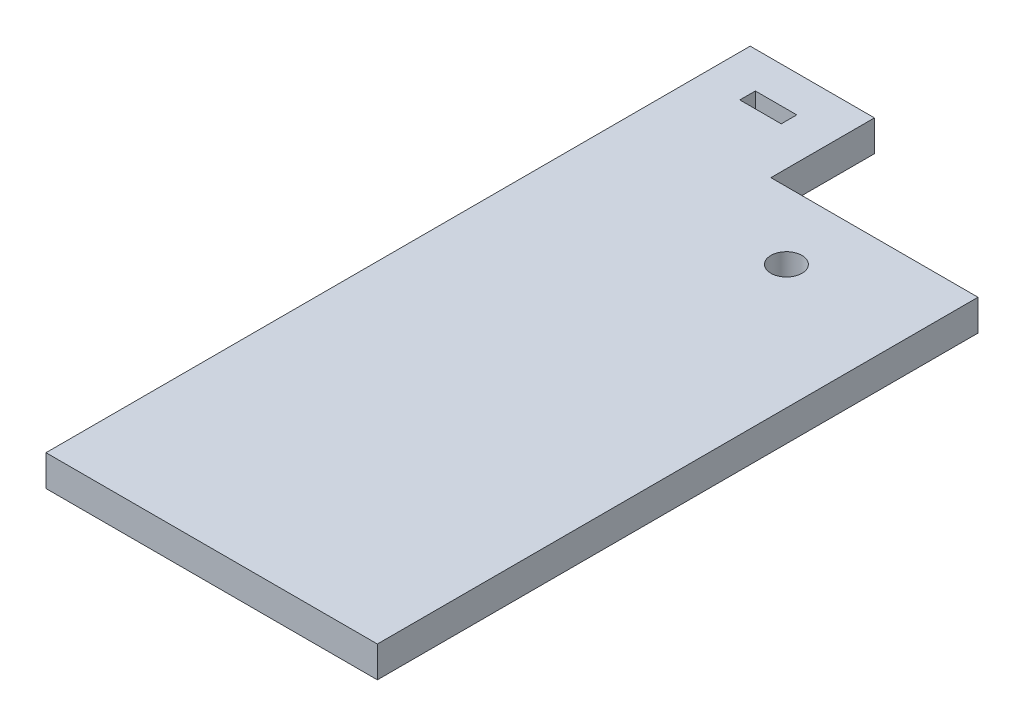
ISO-10303-21;
HEADER;
FILE_DESCRIPTION(('STEP AP214'),'2;1');
FILE_NAME('part.step','',(''),(''),'','','');
FILE_SCHEMA(('AUTOMOTIVE_DESIGN { 1 0 10303 214 1 1 1 1 }'));
ENDSEC;
DATA;
#1=APPLICATION_CONTEXT('core data for automotive mechanical design processes');
#2=APPLICATION_PROTOCOL_DEFINITION('international standard','automotive_design',2000,#1);
#3=PRODUCT_CONTEXT('',#1,'mechanical');
#4=PRODUCT('Part','Part','',(#3));
#5=PRODUCT_RELATED_PRODUCT_CATEGORY('part','',(#4));
#6=PRODUCT_DEFINITION_FORMATION('','',#4);
#7=PRODUCT_DEFINITION_CONTEXT('part definition',#1,'design');
#8=PRODUCT_DEFINITION('design','',#6,#7);
#9=PRODUCT_DEFINITION_SHAPE('','',#8);
#10=(LENGTH_UNIT() NAMED_UNIT(*) SI_UNIT(.MILLI.,.METRE.));
#11=(NAMED_UNIT(*) PLANE_ANGLE_UNIT() SI_UNIT($,.RADIAN.));
#12=(NAMED_UNIT(*) SI_UNIT($,.STERADIAN.) SOLID_ANGLE_UNIT());
#13=UNCERTAINTY_MEASURE_WITH_UNIT(LENGTH_MEASURE(1.E-05),#10,'distance_accuracy_value','');
#14=(GEOMETRIC_REPRESENTATION_CONTEXT(3) GLOBAL_UNCERTAINTY_ASSIGNED_CONTEXT((#13)) GLOBAL_UNIT_ASSIGNED_CONTEXT((#10,
#11,#12)) REPRESENTATION_CONTEXT('',''));
#15=CARTESIAN_POINT('',(0.,0.,0.));
#16=DIRECTION('',(0.,0.,1.));
#17=DIRECTION('',(1.,0.,0.));
#18=AXIS2_PLACEMENT_3D('',#15,#16,#17);
#19=CARTESIAN_POINT('',(0.,3.,0.));
#20=DIRECTION('',(0.,-1.,0.));
#21=DIRECTION('',(0.,0.,-1.));
#22=AXIS2_PLACEMENT_3D('',#19,#20,#21);
#23=PLANE('',#22);
#24=CARTESIAN_POINT('',(20.,3.,-51.5));
#25=DIRECTION('',(0.,1.,0.));
#26=DIRECTION('',(0.,0.,1.));
#27=AXIS2_PLACEMENT_3D('',#24,#25,#26);
#28=CIRCLE('',#27,1.5);
#29=CARTESIAN_POINT('',(20.,3.,-50.));
#30=VERTEX_POINT('',#29);
#31=EDGE_CURVE('E162',#30,#30,#28,.T.);
#32=ORIENTED_EDGE('',*,*,#31,.F.);
#33=EDGE_LOOP('',(#32));
#34=FACE_BOUND('',#33,.T.);
#35=DIRECTION('',(1.,0.,0.));
#36=VECTOR('',#35,1.);
#37=CARTESIAN_POINT('',(0.,3.,0.));
#38=LINE('',#37,#36);
#39=CARTESIAN_POINT('',(0.,3.,0.));
#40=VERTEX_POINT('',#39);
#41=CARTESIAN_POINT('',(32.,3.,0.));
#42=VERTEX_POINT('',#41);
#43=EDGE_CURVE('E132',#40,#42,#38,.T.);
#44=ORIENTED_EDGE('',*,*,#43,.T.);
#45=DIRECTION('',(0.,0.,1.));
#46=VECTOR('',#45,1.);
#47=CARTESIAN_POINT('',(32.,3.,-68.));
#48=LINE('',#47,#46);
#49=CARTESIAN_POINT('',(32.,3.,-58.));
#50=VERTEX_POINT('',#49);
#51=EDGE_CURVE('E120',#50,#42,#48,.T.);
#52=ORIENTED_EDGE('',*,*,#51,.F.);
#53=DIRECTION('',(-1.,0.,0.));
#54=VECTOR('',#53,1.);
#55=CARTESIAN_POINT('',(12.,3.,-58.));
#56=LINE('',#55,#54);
#57=CARTESIAN_POINT('',(12.,3.,-58.));
#58=VERTEX_POINT('',#57);
#59=EDGE_CURVE('E143',#50,#58,#56,.T.);
#60=ORIENTED_EDGE('',*,*,#59,.T.);
#61=DIRECTION('',(0.,0.,-1.));
#62=VECTOR('',#61,1.);
#63=CARTESIAN_POINT('',(12.,3.,-68.));
#64=LINE('',#63,#62);
#65=CARTESIAN_POINT('',(12.,3.,-68.));
#66=VERTEX_POINT('',#65);
#67=EDGE_CURVE('E147',#58,#66,#64,.T.);
#68=ORIENTED_EDGE('',*,*,#67,.T.);
#69=DIRECTION('',(-1.,0.,0.));
#70=VECTOR('',#69,1.);
#71=CARTESIAN_POINT('',(0.,3.,-68.));
#72=LINE('',#71,#70);
#73=CARTESIAN_POINT('',(0.,3.,-68.));
#74=VERTEX_POINT('',#73);
#75=EDGE_CURVE('E155',#66,#74,#72,.T.);
#76=ORIENTED_EDGE('',*,*,#75,.T.);
#77=DIRECTION('',(0.,0.,1.));
#78=VECTOR('',#77,1.);
#79=CARTESIAN_POINT('',(0.,3.,0.));
#80=LINE('',#79,#78);
#81=EDGE_CURVE('E140',#74,#40,#80,.T.);
#82=ORIENTED_EDGE('',*,*,#81,.T.);
#83=EDGE_LOOP('',(#44,#52,#60,#68,#76,#82));
#84=FACE_BOUND('',#83,.T.);
#85=DIRECTION('',(0.,0.,1.));
#86=VECTOR('',#85,1.);
#87=CARTESIAN_POINT('',(4.,3.,-64.5));
#88=LINE('',#87,#86);
#89=CARTESIAN_POINT('',(4.,3.,-64.5));
#90=VERTEX_POINT('',#89);
#91=CARTESIAN_POINT('',(4.,3.,-63.));
#92=VERTEX_POINT('',#91);
#93=EDGE_CURVE('E202',#90,#92,#88,.T.);
#94=ORIENTED_EDGE('',*,*,#93,.F.);
#95=DIRECTION('',(-1.,0.,0.));
#96=VECTOR('',#95,1.);
#97=CARTESIAN_POINT('',(4.,3.,-64.5));
#98=LINE('',#97,#96);
#99=CARTESIAN_POINT('',(8.,3.,-64.5));
#100=VERTEX_POINT('',#99);
#101=EDGE_CURVE('E212',#100,#90,#98,.T.);
#102=ORIENTED_EDGE('',*,*,#101,.F.);
#103=DIRECTION('',(0.,0.,-1.));
#104=VECTOR('',#103,1.);
#105=CARTESIAN_POINT('',(8.,3.,-64.5));
#106=LINE('',#105,#104);
#107=CARTESIAN_POINT('',(8.,3.,-63.));
#108=VERTEX_POINT('',#107);
#109=EDGE_CURVE('E209',#108,#100,#106,.T.);
#110=ORIENTED_EDGE('',*,*,#109,.F.);
#111=DIRECTION('',(1.,0.,0.));
#112=VECTOR('',#111,1.);
#113=CARTESIAN_POINT('',(4.,3.,-63.));
#114=LINE('',#113,#112);
#115=EDGE_CURVE('E205',#92,#108,#114,.T.);
#116=ORIENTED_EDGE('',*,*,#115,.F.);
#117=EDGE_LOOP('',(#94,#102,#110,#116));
#118=FACE_BOUND('',#117,.T.);
#119=ADVANCED_FACE('F45',(#34,#84,#118),#23,.F.);
#120=CARTESIAN_POINT('',(0.,0.,0.));
#121=DIRECTION('',(0.,-1.,0.));
#122=DIRECTION('',(0.,0.,-1.));
#123=AXIS2_PLACEMENT_3D('',#120,#121,#122);
#124=PLANE('',#123);
#125=DIRECTION('',(0.,0.,1.));
#126=VECTOR('',#125,1.);
#127=CARTESIAN_POINT('',(32.,0.,-68.));
#128=LINE('',#127,#126);
#129=CARTESIAN_POINT('',(32.,0.,-58.));
#130=VERTEX_POINT('',#129);
#131=CARTESIAN_POINT('',(32.,0.,0.));
#132=VERTEX_POINT('',#131);
#133=EDGE_CURVE('E61',#130,#132,#128,.T.);
#134=ORIENTED_EDGE('',*,*,#133,.T.);
#135=DIRECTION('',(1.,0.,0.));
#136=VECTOR('',#135,1.);
#137=CARTESIAN_POINT('',(0.,0.,0.));
#138=LINE('',#137,#136);
#139=CARTESIAN_POINT('',(0.,0.,0.));
#140=VERTEX_POINT('',#139);
#141=EDGE_CURVE('E135',#140,#132,#138,.T.);
#142=ORIENTED_EDGE('',*,*,#141,.F.);
#143=DIRECTION('',(0.,0.,1.));
#144=VECTOR('',#143,1.);
#145=CARTESIAN_POINT('',(0.,0.,-58.));
#146=LINE('',#145,#144);
#147=CARTESIAN_POINT('',(0.,0.,-68.));
#148=VERTEX_POINT('',#147);
#149=EDGE_CURVE('E149',#148,#140,#146,.T.);
#150=ORIENTED_EDGE('',*,*,#149,.F.);
#151=DIRECTION('',(-1.,0.,0.));
#152=VECTOR('',#151,1.);
#153=CARTESIAN_POINT('',(0.,0.,-68.));
#154=LINE('',#153,#152);
#155=CARTESIAN_POINT('',(12.,0.,-68.));
#156=VERTEX_POINT('',#155);
#157=EDGE_CURVE('E168',#156,#148,#154,.T.);
#158=ORIENTED_EDGE('',*,*,#157,.F.);
#159=DIRECTION('',(0.,0.,-1.));
#160=VECTOR('',#159,1.);
#161=CARTESIAN_POINT('',(12.,0.,-68.));
#162=LINE('',#161,#160);
#163=CARTESIAN_POINT('',(12.,0.,-58.));
#164=VERTEX_POINT('',#163);
#165=EDGE_CURVE('E165',#164,#156,#162,.T.);
#166=ORIENTED_EDGE('',*,*,#165,.F.);
#167=DIRECTION('',(-1.,0.,0.));
#168=VECTOR('',#167,1.);
#169=CARTESIAN_POINT('',(12.,0.,-58.));
#170=LINE('',#169,#168);
#171=EDGE_CURVE('E161',#130,#164,#170,.T.);
#172=ORIENTED_EDGE('',*,*,#171,.F.);
#173=EDGE_LOOP('',(#134,#142,#150,#158,#166,#172));
#174=FACE_BOUND('',#173,.T.);
#175=CARTESIAN_POINT('',(20.,0.,-51.5));
#176=DIRECTION('',(0.,1.,0.));
#177=DIRECTION('',(0.,0.,1.));
#178=AXIS2_PLACEMENT_3D('',#175,#176,#177);
#179=CIRCLE('',#178,1.5);
#180=CARTESIAN_POINT('',(20.,0.,-50.));
#181=VERTEX_POINT('',#180);
#182=EDGE_CURVE('E238',#181,#181,#179,.T.);
#183=ORIENTED_EDGE('',*,*,#182,.T.);
#184=EDGE_LOOP('',(#183));
#185=FACE_BOUND('',#184,.T.);
#186=DIRECTION('',(-1.,0.,0.));
#187=VECTOR('',#186,1.);
#188=CARTESIAN_POINT('',(4.,0.,-64.5));
#189=LINE('',#188,#187);
#190=CARTESIAN_POINT('',(8.,0.,-64.5));
#191=VERTEX_POINT('',#190);
#192=CARTESIAN_POINT('',(4.,0.,-64.5));
#193=VERTEX_POINT('',#192);
#194=EDGE_CURVE('E206',#191,#193,#189,.T.);
#195=ORIENTED_EDGE('',*,*,#194,.T.);
#196=DIRECTION('',(0.,0.,1.));
#197=VECTOR('',#196,1.);
#198=CARTESIAN_POINT('',(4.,0.,-64.5));
#199=LINE('',#198,#197);
#200=CARTESIAN_POINT('',(4.,0.,-63.));
#201=VERTEX_POINT('',#200);
#202=EDGE_CURVE('E195',#193,#201,#199,.T.);
#203=ORIENTED_EDGE('',*,*,#202,.T.);
#204=DIRECTION('',(1.,0.,0.));
#205=VECTOR('',#204,1.);
#206=CARTESIAN_POINT('',(4.,0.,-63.));
#207=LINE('',#206,#205);
#208=CARTESIAN_POINT('',(8.,0.,-63.));
#209=VERTEX_POINT('',#208);
#210=EDGE_CURVE('E199',#201,#209,#207,.T.);
#211=ORIENTED_EDGE('',*,*,#210,.T.);
#212=DIRECTION('',(0.,0.,-1.));
#213=VECTOR('',#212,1.);
#214=CARTESIAN_POINT('',(8.,0.,-64.5));
#215=LINE('',#214,#213);
#216=EDGE_CURVE('E219',#209,#191,#215,.T.);
#217=ORIENTED_EDGE('',*,*,#216,.T.);
#218=EDGE_LOOP('',(#195,#203,#211,#217));
#219=FACE_BOUND('',#218,.T.);
#220=ADVANCED_FACE('F190',(#174,#185,#219),#124,.T.);
#221=CARTESIAN_POINT('',(0.,3.,0.));
#222=DIRECTION('',(0.,0.,-1.));
#223=DIRECTION('',(-1.,0.,0.));
#224=AXIS2_PLACEMENT_3D('',#221,#222,#223);
#225=PLANE('',#224);
#226=ORIENTED_EDGE('',*,*,#141,.T.);
#227=DIRECTION('',(0.,-1.,0.));
#228=VECTOR('',#227,1.);
#229=CARTESIAN_POINT('',(32.,0.,0.));
#230=LINE('',#229,#228);
#231=EDGE_CURVE('E123',#42,#132,#230,.T.);
#232=ORIENTED_EDGE('',*,*,#231,.F.);
#233=ORIENTED_EDGE('',*,*,#43,.F.);
#234=DIRECTION('',(0.,-1.,0.));
#235=VECTOR('',#234,1.);
#236=CARTESIAN_POINT('',(0.,3.,0.));
#237=LINE('',#236,#235);
#238=EDGE_CURVE('E54',#40,#140,#237,.T.);
#239=ORIENTED_EDGE('',*,*,#238,.T.);
#240=EDGE_LOOP('',(#226,#232,#233,#239));
#241=FACE_BOUND('',#240,.T.);
#242=ADVANCED_FACE('F47',(#241),#225,.F.);
#243=CARTESIAN_POINT('',(12.,3.,-58.));
#244=DIRECTION('',(0.,0.,1.));
#245=DIRECTION('',(1.,0.,0.));
#246=AXIS2_PLACEMENT_3D('',#243,#244,#245);
#247=PLANE('',#246);
#248=ORIENTED_EDGE('',*,*,#59,.F.);
#249=DIRECTION('',(0.,-1.,0.));
#250=VECTOR('',#249,1.);
#251=CARTESIAN_POINT('',(32.,3.,-58.));
#252=LINE('',#251,#250);
#253=EDGE_CURVE('E11',#50,#130,#252,.T.);
#254=ORIENTED_EDGE('',*,*,#253,.T.);
#255=ORIENTED_EDGE('',*,*,#171,.T.);
#256=DIRECTION('',(0.,-1.,0.));
#257=VECTOR('',#256,1.);
#258=CARTESIAN_POINT('',(12.,3.,-58.));
#259=LINE('',#258,#257);
#260=EDGE_CURVE('E180',#58,#164,#259,.T.);
#261=ORIENTED_EDGE('',*,*,#260,.F.);
#262=EDGE_LOOP('',(#248,#254,#255,#261));
#263=FACE_BOUND('',#262,.T.);
#264=ADVANCED_FACE('F275',(#263),#247,.F.);
#265=CARTESIAN_POINT('',(12.,3.,-68.));
#266=DIRECTION('',(-1.,0.,0.));
#267=DIRECTION('',(0.,0.,1.));
#268=AXIS2_PLACEMENT_3D('',#265,#266,#267);
#269=PLANE('',#268);
#270=ORIENTED_EDGE('',*,*,#165,.T.);
#271=DIRECTION('',(0.,-1.,0.));
#272=VECTOR('',#271,1.);
#273=CARTESIAN_POINT('',(12.,3.,-68.));
#274=LINE('',#273,#272);
#275=EDGE_CURVE('E176',#66,#156,#274,.T.);
#276=ORIENTED_EDGE('',*,*,#275,.F.);
#277=ORIENTED_EDGE('',*,*,#67,.F.);
#278=ORIENTED_EDGE('',*,*,#260,.T.);
#279=EDGE_LOOP('',(#270,#276,#277,#278));
#280=FACE_BOUND('',#279,.T.);
#281=ADVANCED_FACE('F272',(#280),#269,.F.);
#282=CARTESIAN_POINT('',(0.,3.,-68.));
#283=DIRECTION('',(0.,0.,1.));
#284=DIRECTION('',(1.,0.,0.));
#285=AXIS2_PLACEMENT_3D('',#282,#283,#284);
#286=PLANE('',#285);
#287=ORIENTED_EDGE('',*,*,#157,.T.);
#288=DIRECTION('',(0.,-1.,0.));
#289=VECTOR('',#288,1.);
#290=CARTESIAN_POINT('',(0.,3.,-68.));
#291=LINE('',#290,#289);
#292=EDGE_CURVE('E158',#74,#148,#291,.T.);
#293=ORIENTED_EDGE('',*,*,#292,.F.);
#294=ORIENTED_EDGE('',*,*,#75,.F.);
#295=ORIENTED_EDGE('',*,*,#275,.T.);
#296=EDGE_LOOP('',(#287,#293,#294,#295));
#297=FACE_BOUND('',#296,.T.);
#298=ADVANCED_FACE('F258',(#297),#286,.F.);
#299=CARTESIAN_POINT('',(0.,3.,-58.));
#300=DIRECTION('',(1.,0.,0.));
#301=DIRECTION('',(0.,0.,-1.));
#302=AXIS2_PLACEMENT_3D('',#299,#300,#301);
#303=PLANE('',#302);
#304=ORIENTED_EDGE('',*,*,#149,.T.);
#305=ORIENTED_EDGE('',*,*,#238,.F.);
#306=ORIENTED_EDGE('',*,*,#81,.F.);
#307=ORIENTED_EDGE('',*,*,#292,.T.);
#308=EDGE_LOOP('',(#304,#305,#306,#307));
#309=FACE_BOUND('',#308,.T.);
#310=ADVANCED_FACE('F185',(#309),#303,.F.);
#311=CARTESIAN_POINT('',(20.,3.,-51.5));
#312=DIRECTION('',(0.,-1.,0.));
#313=DIRECTION('',(0.,0.,-1.));
#314=AXIS2_PLACEMENT_3D('',#311,#312,#313);
#315=CYLINDRICAL_SURFACE('',#314,1.5);
#316=ORIENTED_EDGE('',*,*,#31,.T.);
#317=EDGE_LOOP('',(#316));
#318=FACE_BOUND('',#317,.T.);
#319=ORIENTED_EDGE('',*,*,#182,.F.);
#320=EDGE_LOOP('',(#319));
#321=FACE_BOUND('',#320,.T.);
#322=ADVANCED_FACE('F246',(#318,#321),#315,.F.);
#323=CARTESIAN_POINT('',(4.,3.,-64.5));
#324=DIRECTION('',(1.,0.,0.));
#325=DIRECTION('',(0.,0.,-1.));
#326=AXIS2_PLACEMENT_3D('',#323,#324,#325);
#327=PLANE('',#326);
#328=ORIENTED_EDGE('',*,*,#202,.F.);
#329=DIRECTION('',(0.,-1.,0.));
#330=VECTOR('',#329,1.);
#331=CARTESIAN_POINT('',(4.,3.,-64.5));
#332=LINE('',#331,#330);
#333=EDGE_CURVE('E214',#90,#193,#332,.T.);
#334=ORIENTED_EDGE('',*,*,#333,.F.);
#335=ORIENTED_EDGE('',*,*,#93,.T.);
#336=DIRECTION('',(0.,-1.,0.));
#337=VECTOR('',#336,1.);
#338=CARTESIAN_POINT('',(4.,3.,-63.));
#339=LINE('',#338,#337);
#340=EDGE_CURVE('E234',#92,#201,#339,.T.);
#341=ORIENTED_EDGE('',*,*,#340,.T.);
#342=EDGE_LOOP('',(#328,#334,#335,#341));
#343=FACE_BOUND('',#342,.T.);
#344=ADVANCED_FACE('F248',(#343),#327,.T.);
#345=CARTESIAN_POINT('',(4.,3.,-63.));
#346=DIRECTION('',(0.,0.,-1.));
#347=DIRECTION('',(-1.,0.,0.));
#348=AXIS2_PLACEMENT_3D('',#345,#346,#347);
#349=PLANE('',#348);
#350=ORIENTED_EDGE('',*,*,#210,.F.);
#351=ORIENTED_EDGE('',*,*,#340,.F.);
#352=ORIENTED_EDGE('',*,*,#115,.T.);
#353=DIRECTION('',(0.,-1.,0.));
#354=VECTOR('',#353,1.);
#355=CARTESIAN_POINT('',(8.,3.,-63.));
#356=LINE('',#355,#354);
#357=EDGE_CURVE('E231',#108,#209,#356,.T.);
#358=ORIENTED_EDGE('',*,*,#357,.T.);
#359=EDGE_LOOP('',(#350,#351,#352,#358));
#360=FACE_BOUND('',#359,.T.);
#361=ADVANCED_FACE('F255',(#360),#349,.T.);
#362=CARTESIAN_POINT('',(8.,3.,-64.5));
#363=DIRECTION('',(-1.,0.,0.));
#364=DIRECTION('',(0.,0.,1.));
#365=AXIS2_PLACEMENT_3D('',#362,#363,#364);
#366=PLANE('',#365);
#367=ORIENTED_EDGE('',*,*,#216,.F.);
#368=ORIENTED_EDGE('',*,*,#357,.F.);
#369=ORIENTED_EDGE('',*,*,#109,.T.);
#370=DIRECTION('',(0.,-1.,0.));
#371=VECTOR('',#370,1.);
#372=CARTESIAN_POINT('',(8.,3.,-64.5));
#373=LINE('',#372,#371);
#374=EDGE_CURVE('E68',#100,#191,#373,.T.);
#375=ORIENTED_EDGE('',*,*,#374,.T.);
#376=EDGE_LOOP('',(#367,#368,#369,#375));
#377=FACE_BOUND('',#376,.T.);
#378=ADVANCED_FACE('F337',(#377),#366,.T.);
#379=CARTESIAN_POINT('',(4.,3.,-64.5));
#380=DIRECTION('',(0.,0.,1.));
#381=DIRECTION('',(1.,0.,0.));
#382=AXIS2_PLACEMENT_3D('',#379,#380,#381);
#383=PLANE('',#382);
#384=ORIENTED_EDGE('',*,*,#194,.F.);
#385=ORIENTED_EDGE('',*,*,#374,.F.);
#386=ORIENTED_EDGE('',*,*,#101,.T.);
#387=ORIENTED_EDGE('',*,*,#333,.T.);
#388=EDGE_LOOP('',(#384,#385,#386,#387));
#389=FACE_BOUND('',#388,.T.);
#390=ADVANCED_FACE('F346',(#389),#383,.T.);
#391=CARTESIAN_POINT('',(32.,0.,-68.));
#392=DIRECTION('',(-1.,0.,0.));
#393=DIRECTION('',(0.,0.,1.));
#394=AXIS2_PLACEMENT_3D('',#391,#392,#393);
#395=PLANE('',#394);
#396=ORIENTED_EDGE('',*,*,#51,.T.);
#397=ORIENTED_EDGE('',*,*,#231,.T.);
#398=ORIENTED_EDGE('',*,*,#133,.F.);
#399=ORIENTED_EDGE('',*,*,#253,.F.);
#400=EDGE_LOOP('',(#396,#397,#398,#399));
#401=FACE_BOUND('',#400,.T.);
#402=ADVANCED_FACE('F122',(#401),#395,.F.);
#403=CLOSED_SHELL('',(#119,#220,#242,#264,#281,#298,#310,#322,#344,#361,#378,#390,#402));
#404=MANIFOLD_SOLID_BREP('B2',#403);
#405=ADVANCED_BREP_SHAPE_REPRESENTATION('',(#18,#404),#14);
#406=SHAPE_DEFINITION_REPRESENTATION(#9,#405);
ENDSEC;
END-ISO-10303-21;
